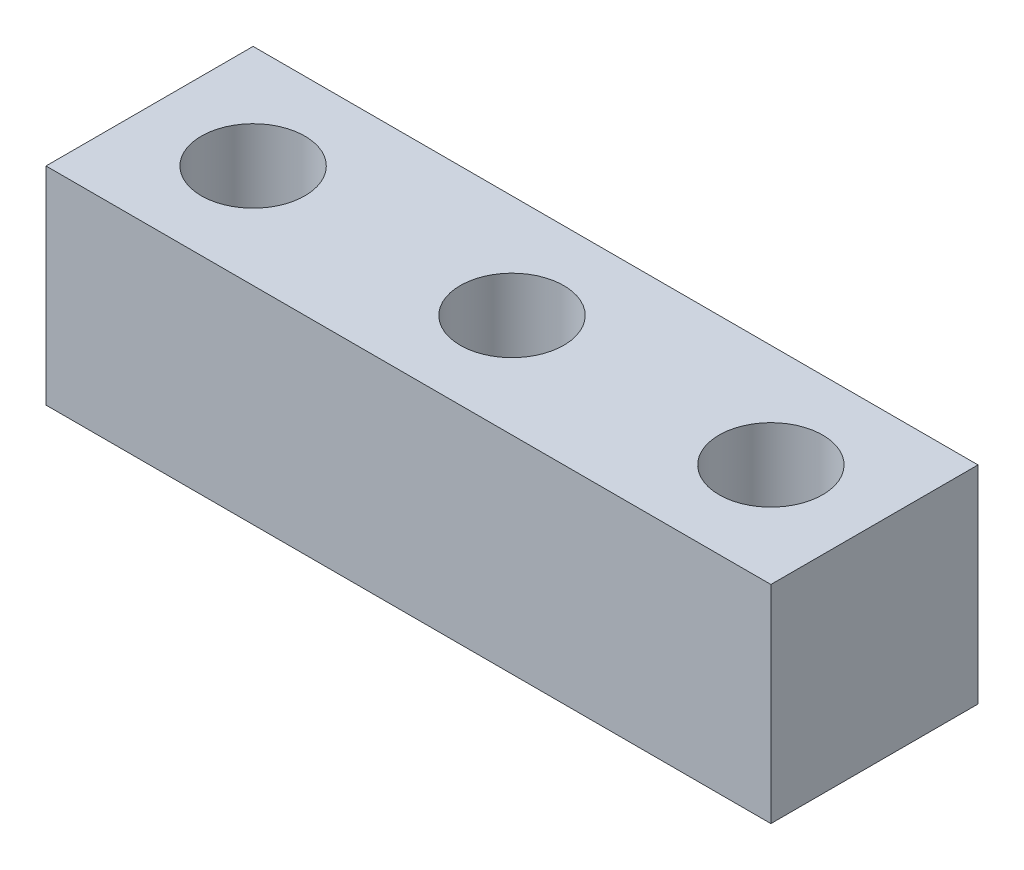
ISO-10303-21;
HEADER;
FILE_DESCRIPTION(('STEP AP214'),'2;1');
FILE_NAME('part.step','',(''),(''),'','','');
FILE_SCHEMA(('AUTOMOTIVE_DESIGN { 1 0 10303 214 1 1 1 1 }'));
ENDSEC;
DATA;
#1=APPLICATION_CONTEXT('core data for automotive mechanical design processes');
#2=APPLICATION_PROTOCOL_DEFINITION('international standard','automotive_design',2000,#1);
#3=PRODUCT_CONTEXT('',#1,'mechanical');
#4=PRODUCT('Part','Part','',(#3));
#5=PRODUCT_RELATED_PRODUCT_CATEGORY('part','',(#4));
#6=PRODUCT_DEFINITION_FORMATION('','',#4);
#7=PRODUCT_DEFINITION_CONTEXT('part definition',#1,'design');
#8=PRODUCT_DEFINITION('design','',#6,#7);
#9=PRODUCT_DEFINITION_SHAPE('','',#8);
#10=(LENGTH_UNIT() NAMED_UNIT(*) SI_UNIT(.MILLI.,.METRE.));
#11=(NAMED_UNIT(*) PLANE_ANGLE_UNIT() SI_UNIT($,.RADIAN.));
#12=(NAMED_UNIT(*) SI_UNIT($,.STERADIAN.) SOLID_ANGLE_UNIT());
#13=UNCERTAINTY_MEASURE_WITH_UNIT(LENGTH_MEASURE(1.E-05),#10,'distance_accuracy_value','');
#14=(GEOMETRIC_REPRESENTATION_CONTEXT(3) GLOBAL_UNCERTAINTY_ASSIGNED_CONTEXT((#13)) GLOBAL_UNIT_ASSIGNED_CONTEXT((#10,
#11,#12)) REPRESENTATION_CONTEXT('',''));
#15=CARTESIAN_POINT('',(0.,0.,0.));
#16=DIRECTION('',(0.,0.,1.));
#17=DIRECTION('',(1.,0.,0.));
#18=AXIS2_PLACEMENT_3D('',#15,#16,#17);
#19=CARTESIAN_POINT('',(22.225,12.7,6.35));
#20=DIRECTION('',(-1.,0.,0.));
#21=DIRECTION('',(0.,0.,1.));
#22=AXIS2_PLACEMENT_3D('',#19,#20,#21);
#23=PLANE('',#22);
#24=DIRECTION('',(0.,0.,-1.));
#25=VECTOR('',#24,1.);
#26=CARTESIAN_POINT('',(22.225,0.,6.35));
#27=LINE('',#26,#25);
#28=CARTESIAN_POINT('',(22.225,0.,6.35));
#29=VERTEX_POINT('',#28);
#30=CARTESIAN_POINT('',(22.225,0.,-6.35));
#31=VERTEX_POINT('',#30);
#32=EDGE_CURVE('E113',#29,#31,#27,.T.);
#33=ORIENTED_EDGE('',*,*,#32,.T.);
#34=DIRECTION('',(0.,-1.,0.));
#35=VECTOR('',#34,1.);
#36=CARTESIAN_POINT('',(22.225,12.7,-6.35));
#37=LINE('',#36,#35);
#38=CARTESIAN_POINT('',(22.225,12.7,-6.35));
#39=VERTEX_POINT('',#38);
#40=EDGE_CURVE('E11',#39,#31,#37,.T.);
#41=ORIENTED_EDGE('',*,*,#40,.F.);
#42=DIRECTION('',(0.,0.,-1.));
#43=VECTOR('',#42,1.);
#44=CARTESIAN_POINT('',(22.225,12.7,6.35));
#45=LINE('',#44,#43);
#46=CARTESIAN_POINT('',(22.225,12.7,6.35));
#47=VERTEX_POINT('',#46);
#48=EDGE_CURVE('E97',#47,#39,#45,.T.);
#49=ORIENTED_EDGE('',*,*,#48,.F.);
#50=DIRECTION('',(0.,-1.,0.));
#51=VECTOR('',#50,1.);
#52=CARTESIAN_POINT('',(22.225,12.7,6.35));
#53=LINE('',#52,#51);
#54=EDGE_CURVE('E109',#47,#29,#53,.T.);
#55=ORIENTED_EDGE('',*,*,#54,.T.);
#56=EDGE_LOOP('',(#33,#41,#49,#55));
#57=FACE_BOUND('',#56,.T.);
#58=ADVANCED_FACE('F45',(#57),#23,.F.);
#59=CARTESIAN_POINT('',(-22.225,12.7,-6.35));
#60=DIRECTION('',(0.,0.,1.));
#61=DIRECTION('',(1.,0.,0.));
#62=AXIS2_PLACEMENT_3D('',#59,#60,#61);
#63=PLANE('',#62);
#64=DIRECTION('',(-1.,0.,0.));
#65=VECTOR('',#64,1.);
#66=CARTESIAN_POINT('',(-22.225,0.,-6.35));
#67=LINE('',#66,#65);
#68=CARTESIAN_POINT('',(-22.225,0.,-6.35));
#69=VERTEX_POINT('',#68);
#70=EDGE_CURVE('E102',#31,#69,#67,.T.);
#71=ORIENTED_EDGE('',*,*,#70,.T.);
#72=DIRECTION('',(0.,-1.,0.));
#73=VECTOR('',#72,1.);
#74=CARTESIAN_POINT('',(-22.225,12.7,-6.35));
#75=LINE('',#74,#73);
#76=CARTESIAN_POINT('',(-22.225,12.7,-6.35));
#77=VERTEX_POINT('',#76);
#78=EDGE_CURVE('E54',#77,#69,#75,.T.);
#79=ORIENTED_EDGE('',*,*,#78,.F.);
#80=DIRECTION('',(-1.,0.,0.));
#81=VECTOR('',#80,1.);
#82=CARTESIAN_POINT('',(-22.225,12.7,-6.35));
#83=LINE('',#82,#81);
#84=EDGE_CURVE('E92',#39,#77,#83,.T.);
#85=ORIENTED_EDGE('',*,*,#84,.F.);
#86=ORIENTED_EDGE('',*,*,#40,.T.);
#87=EDGE_LOOP('',(#71,#79,#85,#86));
#88=FACE_BOUND('',#87,.T.);
#89=ADVANCED_FACE('F101',(#88),#63,.F.);
#90=CARTESIAN_POINT('',(-22.225,12.7,6.35));
#91=DIRECTION('',(1.,0.,0.));
#92=DIRECTION('',(0.,0.,-1.));
#93=AXIS2_PLACEMENT_3D('',#90,#91,#92);
#94=PLANE('',#93);
#95=DIRECTION('',(0.,0.,1.));
#96=VECTOR('',#95,1.);
#97=CARTESIAN_POINT('',(-22.225,0.,6.35));
#98=LINE('',#97,#96);
#99=CARTESIAN_POINT('',(-22.225,0.,6.35));
#100=VERTEX_POINT('',#99);
#101=EDGE_CURVE('E79',#69,#100,#98,.T.);
#102=ORIENTED_EDGE('',*,*,#101,.T.);
#103=DIRECTION('',(0.,-1.,0.));
#104=VECTOR('',#103,1.);
#105=CARTESIAN_POINT('',(-22.225,12.7,6.35));
#106=LINE('',#105,#104);
#107=CARTESIAN_POINT('',(-22.225,12.7,6.35));
#108=VERTEX_POINT('',#107);
#109=EDGE_CURVE('E104',#108,#100,#106,.T.);
#110=ORIENTED_EDGE('',*,*,#109,.F.);
#111=DIRECTION('',(0.,0.,1.));
#112=VECTOR('',#111,1.);
#113=CARTESIAN_POINT('',(-22.225,12.7,6.35));
#114=LINE('',#113,#112);
#115=EDGE_CURVE('E95',#77,#108,#114,.T.);
#116=ORIENTED_EDGE('',*,*,#115,.F.);
#117=ORIENTED_EDGE('',*,*,#78,.T.);
#118=EDGE_LOOP('',(#102,#110,#116,#117));
#119=FACE_BOUND('',#118,.T.);
#120=ADVANCED_FACE('F105',(#119),#94,.F.);
#121=CARTESIAN_POINT('',(-22.225,12.7,6.35));
#122=DIRECTION('',(0.,0.,-1.));
#123=DIRECTION('',(-1.,0.,0.));
#124=AXIS2_PLACEMENT_3D('',#121,#122,#123);
#125=PLANE('',#124);
#126=DIRECTION('',(1.,0.,0.));
#127=VECTOR('',#126,1.);
#128=CARTESIAN_POINT('',(-22.225,0.,6.35));
#129=LINE('',#128,#127);
#130=EDGE_CURVE('E85',#100,#29,#129,.T.);
#131=ORIENTED_EDGE('',*,*,#130,.T.);
#132=ORIENTED_EDGE('',*,*,#54,.F.);
#133=DIRECTION('',(1.,0.,0.));
#134=VECTOR('',#133,1.);
#135=CARTESIAN_POINT('',(-22.225,12.7,6.35));
#136=LINE('',#135,#134);
#137=EDGE_CURVE('E62',#108,#47,#136,.T.);
#138=ORIENTED_EDGE('',*,*,#137,.F.);
#139=ORIENTED_EDGE('',*,*,#109,.T.);
#140=EDGE_LOOP('',(#131,#132,#138,#139));
#141=FACE_BOUND('',#140,.T.);
#142=ADVANCED_FACE('F127',(#141),#125,.F.);
#143=CARTESIAN_POINT('',(0.,12.7,0.));
#144=DIRECTION('',(0.,-1.,0.));
#145=DIRECTION('',(0.,0.,-1.));
#146=AXIS2_PLACEMENT_3D('',#143,#144,#145);
#147=PLANE('',#146);
#148=CARTESIAN_POINT('',(0.,12.7,0.));
#149=DIRECTION('',(0.,1.,0.));
#150=DIRECTION('',(0.,0.,1.));
#151=AXIS2_PLACEMENT_3D('',#148,#149,#150);
#152=CIRCLE('',#151,3.175);
#153=CARTESIAN_POINT('',(0.,12.7,3.175));
#154=VERTEX_POINT('',#153);
#155=EDGE_CURVE('E150',#154,#154,#152,.T.);
#156=ORIENTED_EDGE('',*,*,#155,.F.);
#157=EDGE_LOOP('',(#156));
#158=FACE_BOUND('',#157,.T.);
#159=CARTESIAN_POINT('',(-15.875,12.7,0.));
#160=DIRECTION('',(0.,1.,0.));
#161=DIRECTION('',(0.,0.,1.));
#162=AXIS2_PLACEMENT_3D('',#159,#160,#161);
#163=CIRCLE('',#162,3.175);
#164=CARTESIAN_POINT('',(-15.875,12.7,3.175));
#165=VERTEX_POINT('',#164);
#166=EDGE_CURVE('E143',#165,#165,#163,.T.);
#167=ORIENTED_EDGE('',*,*,#166,.F.);
#168=EDGE_LOOP('',(#167));
#169=FACE_BOUND('',#168,.T.);
#170=CARTESIAN_POINT('',(15.875,12.7,0.));
#171=DIRECTION('',(0.,1.,0.));
#172=DIRECTION('',(0.,0.,1.));
#173=AXIS2_PLACEMENT_3D('',#170,#171,#172);
#174=CIRCLE('',#173,3.175);
#175=CARTESIAN_POINT('',(15.875,12.7,3.175));
#176=VERTEX_POINT('',#175);
#177=EDGE_CURVE('E138',#176,#176,#174,.T.);
#178=ORIENTED_EDGE('',*,*,#177,.F.);
#179=EDGE_LOOP('',(#178));
#180=FACE_BOUND('',#179,.T.);
#181=ORIENTED_EDGE('',*,*,#48,.T.);
#182=ORIENTED_EDGE('',*,*,#84,.T.);
#183=ORIENTED_EDGE('',*,*,#115,.T.);
#184=ORIENTED_EDGE('',*,*,#137,.T.);
#185=EDGE_LOOP('',(#181,#182,#183,#184));
#186=FACE_BOUND('',#185,.T.);
#187=ADVANCED_FACE('F93',(#158,#169,#180,#186),#147,.F.);
#188=CARTESIAN_POINT('',(0.,0.,0.));
#189=DIRECTION('',(0.,-1.,0.));
#190=DIRECTION('',(0.,0.,-1.));
#191=AXIS2_PLACEMENT_3D('',#188,#189,#190);
#192=PLANE('',#191);
#193=CARTESIAN_POINT('',(0.,0.,0.));
#194=DIRECTION('',(0.,1.,0.));
#195=DIRECTION('',(0.,0.,1.));
#196=AXIS2_PLACEMENT_3D('',#193,#194,#195);
#197=CIRCLE('',#196,3.175);
#198=CARTESIAN_POINT('',(0.,0.,3.175));
#199=VERTEX_POINT('',#198);
#200=EDGE_CURVE('E139',#199,#199,#197,.T.);
#201=ORIENTED_EDGE('',*,*,#200,.T.);
#202=EDGE_LOOP('',(#201));
#203=FACE_BOUND('',#202,.T.);
#204=CARTESIAN_POINT('',(-15.875,0.,0.));
#205=DIRECTION('',(0.,1.,0.));
#206=DIRECTION('',(0.,0.,1.));
#207=AXIS2_PLACEMENT_3D('',#204,#205,#206);
#208=CIRCLE('',#207,3.175);
#209=CARTESIAN_POINT('',(-15.875,0.,3.175));
#210=VERTEX_POINT('',#209);
#211=EDGE_CURVE('E117',#210,#210,#208,.T.);
#212=ORIENTED_EDGE('',*,*,#211,.T.);
#213=EDGE_LOOP('',(#212));
#214=FACE_BOUND('',#213,.T.);
#215=CARTESIAN_POINT('',(15.875,0.,0.));
#216=DIRECTION('',(0.,1.,0.));
#217=DIRECTION('',(0.,0.,1.));
#218=AXIS2_PLACEMENT_3D('',#215,#216,#217);
#219=CIRCLE('',#218,3.175);
#220=CARTESIAN_POINT('',(15.875,0.,3.175));
#221=VERTEX_POINT('',#220);
#222=EDGE_CURVE('E134',#221,#221,#219,.T.);
#223=ORIENTED_EDGE('',*,*,#222,.T.);
#224=EDGE_LOOP('',(#223));
#225=FACE_BOUND('',#224,.T.);
#226=ORIENTED_EDGE('',*,*,#32,.F.);
#227=ORIENTED_EDGE('',*,*,#130,.F.);
#228=ORIENTED_EDGE('',*,*,#101,.F.);
#229=ORIENTED_EDGE('',*,*,#70,.F.);
#230=EDGE_LOOP('',(#226,#227,#228,#229));
#231=FACE_BOUND('',#230,.T.);
#232=ADVANCED_FACE('F130',(#203,#214,#225,#231),#192,.T.);
#233=CARTESIAN_POINT('',(15.875,0.,0.));
#234=DIRECTION('',(0.,1.,0.));
#235=DIRECTION('',(0.,0.,1.));
#236=AXIS2_PLACEMENT_3D('',#233,#234,#235);
#237=CYLINDRICAL_SURFACE('',#236,3.175);
#238=ORIENTED_EDGE('',*,*,#222,.F.);
#239=EDGE_LOOP('',(#238));
#240=FACE_BOUND('',#239,.T.);
#241=ORIENTED_EDGE('',*,*,#177,.T.);
#242=EDGE_LOOP('',(#241));
#243=FACE_BOUND('',#242,.T.);
#244=ADVANCED_FACE('F174',(#240,#243),#237,.F.);
#245=CARTESIAN_POINT('',(-15.875,0.,0.));
#246=DIRECTION('',(0.,1.,0.));
#247=DIRECTION('',(0.,0.,1.));
#248=AXIS2_PLACEMENT_3D('',#245,#246,#247);
#249=CYLINDRICAL_SURFACE('',#248,3.175);
#250=ORIENTED_EDGE('',*,*,#211,.F.);
#251=EDGE_LOOP('',(#250));
#252=FACE_BOUND('',#251,.T.);
#253=ORIENTED_EDGE('',*,*,#166,.T.);
#254=EDGE_LOOP('',(#253));
#255=FACE_BOUND('',#254,.T.);
#256=ADVANCED_FACE('F163',(#252,#255),#249,.F.);
#257=CARTESIAN_POINT('',(0.,0.,0.));
#258=DIRECTION('',(0.,1.,0.));
#259=DIRECTION('',(0.,0.,1.));
#260=AXIS2_PLACEMENT_3D('',#257,#258,#259);
#261=CYLINDRICAL_SURFACE('',#260,3.175);
#262=ORIENTED_EDGE('',*,*,#200,.F.);
#263=EDGE_LOOP('',(#262));
#264=FACE_BOUND('',#263,.T.);
#265=ORIENTED_EDGE('',*,*,#155,.T.);
#266=EDGE_LOOP('',(#265));
#267=FACE_BOUND('',#266,.T.);
#268=ADVANCED_FACE('F160',(#264,#267),#261,.F.);
#269=CLOSED_SHELL('',(#58,#89,#120,#142,#187,#232,#244,#256,#268));
#270=MANIFOLD_SOLID_BREP('B2',#269);
#271=ADVANCED_BREP_SHAPE_REPRESENTATION('',(#18,#270),#14);
#272=SHAPE_DEFINITION_REPRESENTATION(#9,#271);
ENDSEC;
END-ISO-10303-21;
